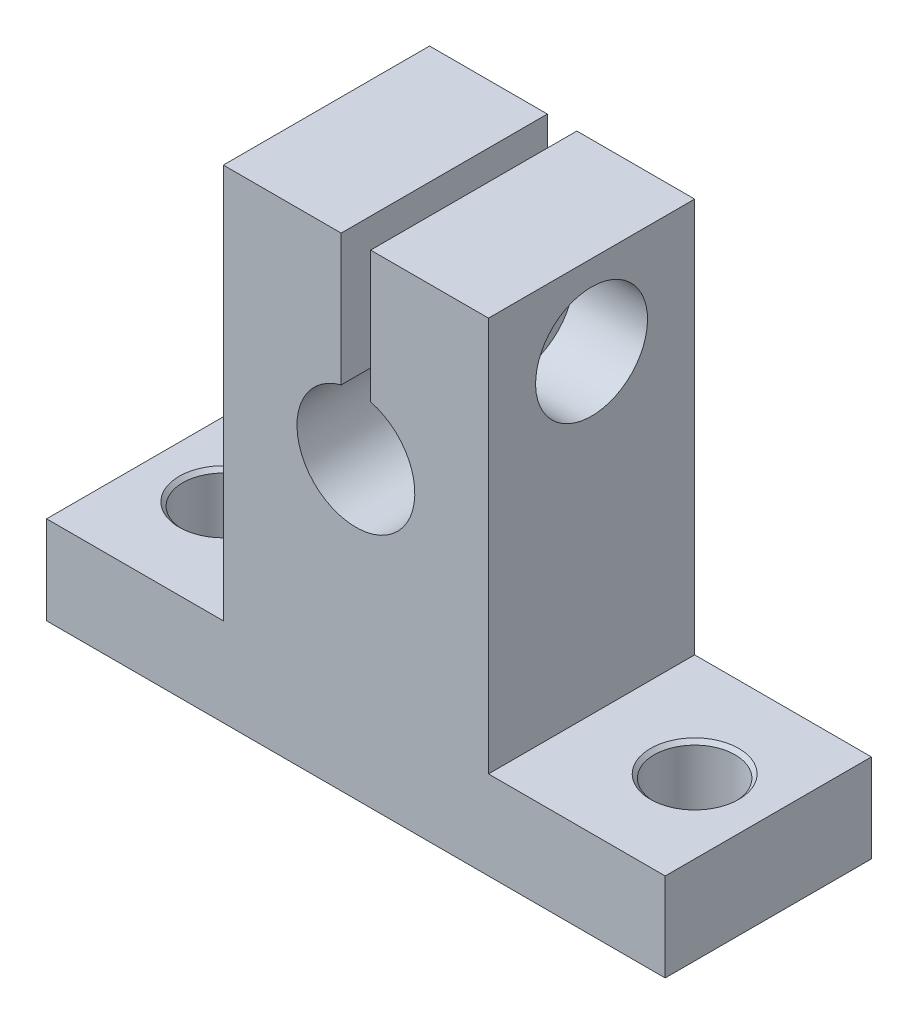
ISO-10303-21;
HEADER;
FILE_DESCRIPTION(('STEP AP214'),'2;1');
FILE_NAME('part.step','',(''),(''),'','','');
FILE_SCHEMA(('AUTOMOTIVE_DESIGN { 1 0 10303 214 1 1 1 1 }'));
ENDSEC;
DATA;
#1=APPLICATION_CONTEXT('core data for automotive mechanical design processes');
#2=APPLICATION_PROTOCOL_DEFINITION('international standard','automotive_design',2000,#1);
#3=PRODUCT_CONTEXT('',#1,'mechanical');
#4=PRODUCT('Part','Part','',(#3));
#5=PRODUCT_RELATED_PRODUCT_CATEGORY('part','',(#4));
#6=PRODUCT_DEFINITION_FORMATION('','',#4);
#7=PRODUCT_DEFINITION_CONTEXT('part definition',#1,'design');
#8=PRODUCT_DEFINITION('design','',#6,#7);
#9=PRODUCT_DEFINITION_SHAPE('','',#8);
#10=(LENGTH_UNIT() NAMED_UNIT(*) SI_UNIT(.MILLI.,.METRE.));
#11=(NAMED_UNIT(*) PLANE_ANGLE_UNIT() SI_UNIT($,.RADIAN.));
#12=(NAMED_UNIT(*) SI_UNIT($,.STERADIAN.) SOLID_ANGLE_UNIT());
#13=UNCERTAINTY_MEASURE_WITH_UNIT(LENGTH_MEASURE(1.E-05),#10,'distance_accuracy_value','');
#14=(GEOMETRIC_REPRESENTATION_CONTEXT(3) GLOBAL_UNCERTAINTY_ASSIGNED_CONTEXT((#13)) GLOBAL_UNIT_ASSIGNED_CONTEXT((#10,
#11,#12)) REPRESENTATION_CONTEXT('',''));
#15=CARTESIAN_POINT('',(0.,0.,0.));
#16=DIRECTION('',(0.,0.,1.));
#17=DIRECTION('',(1.,0.,0.));
#18=AXIS2_PLACEMENT_3D('',#15,#16,#17);
#19=CARTESIAN_POINT('',(-4.93969696196699,10.9364916731037,0.));
#20=DIRECTION('',(1.,0.,0.));
#21=DIRECTION('',(0.,1.,0.));
#22=AXIS2_PLACEMENT_3D('',#19,#20,#21);
#23=CYLINDRICAL_SURFACE('',#22,2.1);
#24=CARTESIAN_POINT('',(1.,10.9364916731037,0.));
#25=DIRECTION('',(1.,0.,0.));
#26=DIRECTION('',(0.,1.,0.));
#27=AXIS2_PLACEMENT_3D('',#24,#25,#26);
#28=CIRCLE('',#27,2.1);
#29=CARTESIAN_POINT('',(1.,13.0364916731037,0.));
#30=VERTEX_POINT('',#29);
#31=EDGE_CURVE('E214',#30,#30,#28,.F.);
#32=ORIENTED_EDGE('',*,*,#31,.T.);
#33=EDGE_LOOP('',(#32));
#34=FACE_BOUND('',#33,.T.);
#35=CARTESIAN_POINT('',(4.,10.9364916731037,0.));
#36=DIRECTION('',(1.,0.,0.));
#37=DIRECTION('',(0.,1.,0.));
#38=AXIS2_PLACEMENT_3D('',#35,#36,#37);
#39=CIRCLE('',#38,2.1);
#40=CARTESIAN_POINT('',(4.,13.0364916731037,0.));
#41=VERTEX_POINT('',#40);
#42=EDGE_CURVE('E211',#41,#41,#39,.F.);
#43=ORIENTED_EDGE('',*,*,#42,.F.);
#44=EDGE_LOOP('',(#43));
#45=FACE_BOUND('',#44,.T.);
#46=ADVANCED_FACE('F38',(#34,#45),#23,.F.);
#47=CARTESIAN_POINT('',(-9.,-10.4,7.));
#48=DIRECTION('',(1.,0.,0.));
#49=DIRECTION('',(0.,1.,0.));
#50=AXIS2_PLACEMENT_3D('',#47,#48,#49);
#51=PLANE('',#50);
#52=CARTESIAN_POINT('',(-9.,10.9364916731037,0.));
#53=DIRECTION('',(1.,0.,0.));
#54=DIRECTION('',(0.,1.,0.));
#55=AXIS2_PLACEMENT_3D('',#52,#53,#54);
#56=CIRCLE('',#55,1.9);
#57=CARTESIAN_POINT('',(-9.,12.8364916731037,0.));
#58=VERTEX_POINT('',#57);
#59=EDGE_CURVE('E11',#58,#58,#56,.T.);
#60=ORIENTED_EDGE('',*,*,#59,.T.);
#61=EDGE_LOOP('',(#60));
#62=FACE_BOUND('',#61,.T.);
#63=DIRECTION('',(0.,-1.,0.));
#64=VECTOR('',#63,1.);
#65=CARTESIAN_POINT('',(-9.,-10.4,-7.));
#66=LINE('',#65,#64);
#67=CARTESIAN_POINT('',(-9.,16.4,-7.));
#68=VERTEX_POINT('',#67);
#69=CARTESIAN_POINT('',(-9.,-10.4,-7.));
#70=VERTEX_POINT('',#69);
#71=EDGE_CURVE('E160',#68,#70,#66,.T.);
#72=ORIENTED_EDGE('',*,*,#71,.T.);
#73=DIRECTION('',(0.,0.,-1.));
#74=VECTOR('',#73,1.);
#75=CARTESIAN_POINT('',(-9.,-10.4,7.));
#76=LINE('',#75,#74);
#77=CARTESIAN_POINT('',(-9.,-10.4,7.));
#78=VERTEX_POINT('',#77);
#79=EDGE_CURVE('E208',#78,#70,#76,.T.);
#80=ORIENTED_EDGE('',*,*,#79,.F.);
#81=DIRECTION('',(0.,-1.,0.));
#82=VECTOR('',#81,1.);
#83=CARTESIAN_POINT('',(-9.,-10.4,7.));
#84=LINE('',#83,#82);
#85=CARTESIAN_POINT('',(-9.,16.4,7.));
#86=VERTEX_POINT('',#85);
#87=EDGE_CURVE('E183',#86,#78,#84,.T.);
#88=ORIENTED_EDGE('',*,*,#87,.F.);
#89=DIRECTION('',(0.,0.,-1.));
#90=VECTOR('',#89,1.);
#91=CARTESIAN_POINT('',(-9.,16.4,7.));
#92=LINE('',#91,#90);
#93=EDGE_CURVE('E156',#86,#68,#92,.T.);
#94=ORIENTED_EDGE('',*,*,#93,.T.);
#95=EDGE_LOOP('',(#72,#80,#88,#94));
#96=FACE_BOUND('',#95,.T.);
#97=ADVANCED_FACE('F242',(#62,#96),#51,.F.);
#98=CARTESIAN_POINT('',(-21.,-10.4,7.));
#99=DIRECTION('',(0.,-1.,0.));
#100=DIRECTION('',(0.,0.,-1.));
#101=AXIS2_PLACEMENT_3D('',#98,#99,#100);
#102=PLANE('',#101);
#103=CARTESIAN_POINT('',(-16.,-10.4,0.));
#104=DIRECTION('',(0.,-1.,0.));
#105=DIRECTION('',(0.,0.,-1.));
#106=AXIS2_PLACEMENT_3D('',#103,#104,#105);
#107=CIRCLE('',#106,3.00000000000003);
#108=CARTESIAN_POINT('',(-16.,-10.4,-3.00000000000003));
#109=VERTEX_POINT('',#108);
#110=EDGE_CURVE('E224',#109,#109,#107,.T.);
#111=ORIENTED_EDGE('',*,*,#110,.T.);
#112=EDGE_LOOP('',(#111));
#113=FACE_BOUND('',#112,.T.);
#114=DIRECTION('',(-1.,0.,0.));
#115=VECTOR('',#114,1.);
#116=CARTESIAN_POINT('',(-21.,-10.4,-7.));
#117=LINE('',#116,#115);
#118=CARTESIAN_POINT('',(-21.,-10.4,-7.));
#119=VERTEX_POINT('',#118);
#120=EDGE_CURVE('E163',#70,#119,#117,.T.);
#121=ORIENTED_EDGE('',*,*,#120,.T.);
#122=DIRECTION('',(0.,0.,-1.));
#123=VECTOR('',#122,1.);
#124=CARTESIAN_POINT('',(-21.,-10.4,7.));
#125=LINE('',#124,#123);
#126=CARTESIAN_POINT('',(-21.,-10.4,7.));
#127=VERTEX_POINT('',#126);
#128=EDGE_CURVE('E205',#127,#119,#125,.T.);
#129=ORIENTED_EDGE('',*,*,#128,.F.);
#130=DIRECTION('',(-1.,0.,0.));
#131=VECTOR('',#130,1.);
#132=CARTESIAN_POINT('',(-21.,-10.4,7.));
#133=LINE('',#132,#131);
#134=EDGE_CURVE('E111',#78,#127,#133,.T.);
#135=ORIENTED_EDGE('',*,*,#134,.F.);
#136=ORIENTED_EDGE('',*,*,#79,.T.);
#137=EDGE_LOOP('',(#121,#129,#135,#136));
#138=FACE_BOUND('',#137,.T.);
#139=ADVANCED_FACE('F248',(#113,#138),#102,.F.);
#140=CARTESIAN_POINT('',(-21.,-16.4,7.));
#141=DIRECTION('',(1.,0.,0.));
#142=DIRECTION('',(0.,0.,-1.));
#143=AXIS2_PLACEMENT_3D('',#140,#141,#142);
#144=PLANE('',#143);
#145=DIRECTION('',(0.,-1.,0.));
#146=VECTOR('',#145,1.);
#147=CARTESIAN_POINT('',(-21.,-16.4,-7.));
#148=LINE('',#147,#146);
#149=CARTESIAN_POINT('',(-21.,-16.4,-7.));
#150=VERTEX_POINT('',#149);
#151=EDGE_CURVE('E166',#119,#150,#148,.T.);
#152=ORIENTED_EDGE('',*,*,#151,.T.);
#153=DIRECTION('',(0.,0.,-1.));
#154=VECTOR('',#153,1.);
#155=CARTESIAN_POINT('',(-21.,-16.4,7.));
#156=LINE('',#155,#154);
#157=CARTESIAN_POINT('',(-21.,-16.4,7.));
#158=VERTEX_POINT('',#157);
#159=EDGE_CURVE('E202',#158,#150,#156,.T.);
#160=ORIENTED_EDGE('',*,*,#159,.F.);
#161=DIRECTION('',(0.,-1.,0.));
#162=VECTOR('',#161,1.);
#163=CARTESIAN_POINT('',(-21.,-16.4,7.));
#164=LINE('',#163,#162);
#165=EDGE_CURVE('E336',#127,#158,#164,.T.);
#166=ORIENTED_EDGE('',*,*,#165,.F.);
#167=ORIENTED_EDGE('',*,*,#128,.T.);
#168=EDGE_LOOP('',(#152,#160,#166,#167));
#169=FACE_BOUND('',#168,.T.);
#170=ADVANCED_FACE('F305',(#169),#144,.F.);
#171=CARTESIAN_POINT('',(21.,-16.4,7.));
#172=DIRECTION('',(0.,1.,0.));
#173=DIRECTION('',(-1.,0.,0.));
#174=AXIS2_PLACEMENT_3D('',#171,#172,#173);
#175=PLANE('',#174);
#176=CARTESIAN_POINT('',(16.,-16.4,0.));
#177=DIRECTION('',(0.,1.,0.));
#178=DIRECTION('',(-1.,0.,0.));
#179=AXIS2_PLACEMENT_3D('',#176,#177,#178);
#180=CIRCLE('',#179,2.75);
#181=CARTESIAN_POINT('',(13.25,-16.4,0.));
#182=VERTEX_POINT('',#181);
#183=EDGE_CURVE('E325',#182,#182,#180,.F.);
#184=ORIENTED_EDGE('',*,*,#183,.F.);
#185=EDGE_LOOP('',(#184));
#186=FACE_BOUND('',#185,.T.);
#187=CARTESIAN_POINT('',(-16.,-16.4,0.));
#188=DIRECTION('',(0.,1.,0.));
#189=DIRECTION('',(-1.,0.,0.));
#190=AXIS2_PLACEMENT_3D('',#187,#188,#189);
#191=CIRCLE('',#190,2.75);
#192=CARTESIAN_POINT('',(-18.75,-16.4,0.));
#193=VERTEX_POINT('',#192);
#194=EDGE_CURVE('E164',#193,#193,#191,.F.);
#195=ORIENTED_EDGE('',*,*,#194,.F.);
#196=EDGE_LOOP('',(#195));
#197=FACE_BOUND('',#196,.T.);
#198=DIRECTION('',(1.,0.,0.));
#199=VECTOR('',#198,1.);
#200=CARTESIAN_POINT('',(21.,-16.4,-7.));
#201=LINE('',#200,#199);
#202=CARTESIAN_POINT('',(21.,-16.4,-7.));
#203=VERTEX_POINT('',#202);
#204=EDGE_CURVE('E168',#150,#203,#201,.T.);
#205=ORIENTED_EDGE('',*,*,#204,.T.);
#206=DIRECTION('',(0.,0.,-1.));
#207=VECTOR('',#206,1.);
#208=CARTESIAN_POINT('',(21.,-16.4,7.));
#209=LINE('',#208,#207);
#210=CARTESIAN_POINT('',(21.,-16.4,7.));
#211=VERTEX_POINT('',#210);
#212=EDGE_CURVE('E199',#211,#203,#209,.T.);
#213=ORIENTED_EDGE('',*,*,#212,.F.);
#214=DIRECTION('',(1.,0.,0.));
#215=VECTOR('',#214,1.);
#216=CARTESIAN_POINT('',(21.,-16.4,7.));
#217=LINE('',#216,#215);
#218=EDGE_CURVE('E338',#158,#211,#217,.T.);
#219=ORIENTED_EDGE('',*,*,#218,.F.);
#220=ORIENTED_EDGE('',*,*,#159,.T.);
#221=EDGE_LOOP('',(#205,#213,#219,#220));
#222=FACE_BOUND('',#221,.T.);
#223=ADVANCED_FACE('F301',(#186,#197,#222),#175,.F.);
#224=CARTESIAN_POINT('',(21.,-10.4,7.));
#225=DIRECTION('',(-1.,0.,0.));
#226=DIRECTION('',(0.,0.,1.));
#227=AXIS2_PLACEMENT_3D('',#224,#225,#226);
#228=PLANE('',#227);
#229=DIRECTION('',(0.,1.,0.));
#230=VECTOR('',#229,1.);
#231=CARTESIAN_POINT('',(21.,-10.4,-7.));
#232=LINE('',#231,#230);
#233=CARTESIAN_POINT('',(21.,-10.4,-7.));
#234=VERTEX_POINT('',#233);
#235=EDGE_CURVE('E170',#203,#234,#232,.T.);
#236=ORIENTED_EDGE('',*,*,#235,.T.);
#237=DIRECTION('',(0.,0.,-1.));
#238=VECTOR('',#237,1.);
#239=CARTESIAN_POINT('',(21.,-10.4,7.));
#240=LINE('',#239,#238);
#241=CARTESIAN_POINT('',(21.,-10.4,7.));
#242=VERTEX_POINT('',#241);
#243=EDGE_CURVE('E196',#242,#234,#240,.T.);
#244=ORIENTED_EDGE('',*,*,#243,.F.);
#245=DIRECTION('',(0.,1.,0.));
#246=VECTOR('',#245,1.);
#247=CARTESIAN_POINT('',(21.,-10.4,7.));
#248=LINE('',#247,#246);
#249=EDGE_CURVE('E340',#211,#242,#248,.T.);
#250=ORIENTED_EDGE('',*,*,#249,.F.);
#251=ORIENTED_EDGE('',*,*,#212,.T.);
#252=EDGE_LOOP('',(#236,#244,#250,#251));
#253=FACE_BOUND('',#252,.T.);
#254=ADVANCED_FACE('F297',(#253),#228,.F.);
#255=CARTESIAN_POINT('',(9.,-10.4,7.));
#256=DIRECTION('',(0.,-1.,0.));
#257=DIRECTION('',(1.,0.,0.));
#258=AXIS2_PLACEMENT_3D('',#255,#256,#257);
#259=PLANE('',#258);
#260=CARTESIAN_POINT('',(16.,-10.4,0.));
#261=DIRECTION('',(0.,-1.,0.));
#262=DIRECTION('',(1.,0.,0.));
#263=AXIS2_PLACEMENT_3D('',#260,#261,#262);
#264=CIRCLE('',#263,3.00000000000004);
#265=CARTESIAN_POINT('',(19.,-10.4,0.));
#266=VERTEX_POINT('',#265);
#267=EDGE_CURVE('E218',#266,#266,#264,.T.);
#268=ORIENTED_EDGE('',*,*,#267,.T.);
#269=EDGE_LOOP('',(#268));
#270=FACE_BOUND('',#269,.T.);
#271=DIRECTION('',(-1.,0.,0.));
#272=VECTOR('',#271,1.);
#273=CARTESIAN_POINT('',(9.,-10.4,-7.));
#274=LINE('',#273,#272);
#275=CARTESIAN_POINT('',(9.,-10.4,-7.));
#276=VERTEX_POINT('',#275);
#277=EDGE_CURVE('E172',#234,#276,#274,.T.);
#278=ORIENTED_EDGE('',*,*,#277,.T.);
#279=DIRECTION('',(0.,0.,-1.));
#280=VECTOR('',#279,1.);
#281=CARTESIAN_POINT('',(9.,-10.4,7.));
#282=LINE('',#281,#280);
#283=CARTESIAN_POINT('',(9.,-10.4,7.));
#284=VERTEX_POINT('',#283);
#285=EDGE_CURVE('E193',#284,#276,#282,.T.);
#286=ORIENTED_EDGE('',*,*,#285,.F.);
#287=DIRECTION('',(-1.,0.,0.));
#288=VECTOR('',#287,1.);
#289=CARTESIAN_POINT('',(9.,-10.4,7.));
#290=LINE('',#289,#288);
#291=EDGE_CURVE('E342',#242,#284,#290,.T.);
#292=ORIENTED_EDGE('',*,*,#291,.F.);
#293=ORIENTED_EDGE('',*,*,#243,.T.);
#294=EDGE_LOOP('',(#278,#286,#292,#293));
#295=FACE_BOUND('',#294,.T.);
#296=ADVANCED_FACE('F293',(#270,#295),#259,.F.);
#297=CARTESIAN_POINT('',(9.,16.4,7.));
#298=DIRECTION('',(-1.,0.,0.));
#299=DIRECTION('',(0.,-1.,0.));
#300=AXIS2_PLACEMENT_3D('',#297,#298,#299);
#301=PLANE('',#300);
#302=CARTESIAN_POINT('',(9.,10.9364916731037,0.));
#303=DIRECTION('',(1.,0.,0.));
#304=DIRECTION('',(0.,1.,0.));
#305=AXIS2_PLACEMENT_3D('',#302,#303,#304);
#306=CIRCLE('',#305,3.8);
#307=CARTESIAN_POINT('',(9.,14.7364916731037,0.));
#308=VERTEX_POINT('',#307);
#309=EDGE_CURVE('E375',#308,#308,#306,.T.);
#310=ORIENTED_EDGE('',*,*,#309,.F.);
#311=EDGE_LOOP('',(#310));
#312=FACE_BOUND('',#311,.T.);
#313=DIRECTION('',(0.,1.,0.));
#314=VECTOR('',#313,1.);
#315=CARTESIAN_POINT('',(9.,16.4,-7.));
#316=LINE('',#315,#314);
#317=CARTESIAN_POINT('',(9.,16.4,-7.));
#318=VERTEX_POINT('',#317);
#319=EDGE_CURVE('E174',#276,#318,#316,.T.);
#320=ORIENTED_EDGE('',*,*,#319,.T.);
#321=DIRECTION('',(0.,0.,-1.));
#322=VECTOR('',#321,1.);
#323=CARTESIAN_POINT('',(9.,16.4,7.));
#324=LINE('',#323,#322);
#325=CARTESIAN_POINT('',(9.,16.4,7.));
#326=VERTEX_POINT('',#325);
#327=EDGE_CURVE('E190',#326,#318,#324,.T.);
#328=ORIENTED_EDGE('',*,*,#327,.F.);
#329=DIRECTION('',(0.,1.,0.));
#330=VECTOR('',#329,1.);
#331=CARTESIAN_POINT('',(9.,16.4,7.));
#332=LINE('',#331,#330);
#333=EDGE_CURVE('E344',#284,#326,#332,.T.);
#334=ORIENTED_EDGE('',*,*,#333,.F.);
#335=ORIENTED_EDGE('',*,*,#285,.T.);
#336=EDGE_LOOP('',(#320,#328,#334,#335));
#337=FACE_BOUND('',#336,.T.);
#338=ADVANCED_FACE('F289',(#312,#337),#301,.F.);
#339=CARTESIAN_POINT('',(0.999999999999999,16.4,7.));
#340=DIRECTION('',(0.,-1.,0.));
#341=DIRECTION('',(1.,0.,0.));
#342=AXIS2_PLACEMENT_3D('',#339,#340,#341);
#343=PLANE('',#342);
#344=DIRECTION('',(-1.,0.,0.));
#345=VECTOR('',#344,1.);
#346=CARTESIAN_POINT('',(0.999999999999999,16.4,-7.));
#347=LINE('',#346,#345);
#348=CARTESIAN_POINT('',(0.999999999999999,16.4,-7.));
#349=VERTEX_POINT('',#348);
#350=EDGE_CURVE('E176',#318,#349,#347,.T.);
#351=ORIENTED_EDGE('',*,*,#350,.T.);
#352=DIRECTION('',(0.,0.,-1.));
#353=VECTOR('',#352,1.);
#354=CARTESIAN_POINT('',(0.999999999999999,16.4,7.));
#355=LINE('',#354,#353);
#356=CARTESIAN_POINT('',(0.999999999999999,16.4,7.));
#357=VERTEX_POINT('',#356);
#358=EDGE_CURVE('E187',#357,#349,#355,.T.);
#359=ORIENTED_EDGE('',*,*,#358,.F.);
#360=DIRECTION('',(-1.,0.,0.));
#361=VECTOR('',#360,1.);
#362=CARTESIAN_POINT('',(0.999999999999999,16.4,7.));
#363=LINE('',#362,#361);
#364=EDGE_CURVE('E346',#326,#357,#363,.T.);
#365=ORIENTED_EDGE('',*,*,#364,.F.);
#366=ORIENTED_EDGE('',*,*,#327,.T.);
#367=EDGE_LOOP('',(#351,#359,#365,#366));
#368=FACE_BOUND('',#367,.T.);
#369=ADVANCED_FACE('F285',(#368),#343,.F.);
#370=CARTESIAN_POINT('',(1.,7.47298334620742,7.));
#371=DIRECTION('',(1.,0.,0.));
#372=DIRECTION('',(0.,1.,0.));
#373=AXIS2_PLACEMENT_3D('',#370,#371,#372);
#374=PLANE('',#373);
#375=ORIENTED_EDGE('',*,*,#31,.F.);
#376=EDGE_LOOP('',(#375));
#377=FACE_BOUND('',#376,.T.);
#378=DIRECTION('',(0.,-1.,0.));
#379=VECTOR('',#378,1.);
#380=CARTESIAN_POINT('',(1.,7.47298334620742,-7.));
#381=LINE('',#380,#379);
#382=CARTESIAN_POINT('',(1.,7.47298334620742,-7.));
#383=VERTEX_POINT('',#382);
#384=EDGE_CURVE('E178',#349,#383,#381,.T.);
#385=ORIENTED_EDGE('',*,*,#384,.T.);
#386=DIRECTION('',(0.,0.,-1.));
#387=VECTOR('',#386,1.);
#388=CARTESIAN_POINT('',(1.,7.47298334620742,7.));
#389=LINE('',#388,#387);
#390=CARTESIAN_POINT('',(1.,7.47298334620742,7.));
#391=VERTEX_POINT('',#390);
#392=EDGE_CURVE('E151',#391,#383,#389,.T.);
#393=ORIENTED_EDGE('',*,*,#392,.F.);
#394=DIRECTION('',(0.,-1.,0.));
#395=VECTOR('',#394,1.);
#396=CARTESIAN_POINT('',(1.,7.47298334620742,7.));
#397=LINE('',#396,#395);
#398=EDGE_CURVE('E142',#357,#391,#397,.T.);
#399=ORIENTED_EDGE('',*,*,#398,.F.);
#400=ORIENTED_EDGE('',*,*,#358,.T.);
#401=EDGE_LOOP('',(#385,#393,#399,#400));
#402=FACE_BOUND('',#401,.T.);
#403=ADVANCED_FACE('F282',(#377,#402),#374,.F.);
#404=CARTESIAN_POINT('',(0.,3.6,7.));
#405=DIRECTION('',(0.,0.,-1.));
#406=DIRECTION('',(-1.,0.,0.));
#407=AXIS2_PLACEMENT_3D('',#404,#405,#406);
#408=CYLINDRICAL_SURFACE('',#407,4.);
#409=CARTESIAN_POINT('',(0.,3.6,-7.));
#410=DIRECTION('',(0.,0.,-1.));
#411=DIRECTION('',(1.,0.,0.));
#412=AXIS2_PLACEMENT_3D('',#409,#410,#411);
#413=CIRCLE('',#412,4.);
#414=CARTESIAN_POINT('',(-0.999999999999999,7.47298334620742,-7.));
#415=VERTEX_POINT('',#414);
#416=EDGE_CURVE('E150',#383,#415,#413,.T.);
#417=ORIENTED_EDGE('',*,*,#416,.T.);
#418=DIRECTION('',(0.,0.,-1.));
#419=VECTOR('',#418,1.);
#420=CARTESIAN_POINT('',(-0.999999999999999,7.47298334620742,7.));
#421=LINE('',#420,#419);
#422=CARTESIAN_POINT('',(-0.999999999999999,7.47298334620742,7.));
#423=VERTEX_POINT('',#422);
#424=EDGE_CURVE('E147',#423,#415,#421,.T.);
#425=ORIENTED_EDGE('',*,*,#424,.F.);
#426=CARTESIAN_POINT('',(0.,3.6,7.));
#427=DIRECTION('',(0.,0.,-1.));
#428=DIRECTION('',(1.,0.,0.));
#429=AXIS2_PLACEMENT_3D('',#426,#427,#428);
#430=CIRCLE('',#429,4.);
#431=EDGE_CURVE('E136',#391,#423,#430,.T.);
#432=ORIENTED_EDGE('',*,*,#431,.F.);
#433=ORIENTED_EDGE('',*,*,#392,.T.);
#434=EDGE_LOOP('',(#417,#425,#432,#433));
#435=FACE_BOUND('',#434,.T.);
#436=ADVANCED_FACE('F148',(#435),#408,.F.);
#437=CARTESIAN_POINT('',(-1.,16.4,7.));
#438=DIRECTION('',(-1.,0.,0.));
#439=DIRECTION('',(0.,-1.,0.));
#440=AXIS2_PLACEMENT_3D('',#437,#438,#439);
#441=PLANE('',#440);
#442=CARTESIAN_POINT('',(-0.999999999999998,10.9364916731037,0.));
#443=DIRECTION('',(1.,0.,0.));
#444=DIRECTION('',(0.,0.,-1.));
#445=AXIS2_PLACEMENT_3D('',#442,#443,#444);
#446=CIRCLE('',#445,1.65);
#447=CARTESIAN_POINT('',(-0.999999999999998,10.9364916731037,-1.65));
#448=VERTEX_POINT('',#447);
#449=EDGE_CURVE('E326',#448,#448,#446,.T.);
#450=ORIENTED_EDGE('',*,*,#449,.F.);
#451=EDGE_LOOP('',(#450));
#452=FACE_BOUND('',#451,.T.);
#453=DIRECTION('',(0.,1.,0.));
#454=VECTOR('',#453,1.);
#455=CARTESIAN_POINT('',(-1.,16.4,-7.));
#456=LINE('',#455,#454);
#457=CARTESIAN_POINT('',(-1.,16.4,-7.));
#458=VERTEX_POINT('',#457);
#459=EDGE_CURVE('E96',#415,#458,#456,.T.);
#460=ORIENTED_EDGE('',*,*,#459,.T.);
#461=DIRECTION('',(0.,0.,-1.));
#462=VECTOR('',#461,1.);
#463=CARTESIAN_POINT('',(-1.,16.4,7.));
#464=LINE('',#463,#462);
#465=CARTESIAN_POINT('',(-1.,16.4,7.));
#466=VERTEX_POINT('',#465);
#467=EDGE_CURVE('E152',#466,#458,#464,.T.);
#468=ORIENTED_EDGE('',*,*,#467,.F.);
#469=DIRECTION('',(0.,1.,0.));
#470=VECTOR('',#469,1.);
#471=CARTESIAN_POINT('',(-1.,16.4,7.));
#472=LINE('',#471,#470);
#473=EDGE_CURVE('E140',#423,#466,#472,.T.);
#474=ORIENTED_EDGE('',*,*,#473,.F.);
#475=ORIENTED_EDGE('',*,*,#424,.T.);
#476=EDGE_LOOP('',(#460,#468,#474,#475));
#477=FACE_BOUND('',#476,.T.);
#478=ADVANCED_FACE('F154',(#452,#477),#441,.F.);
#479=CARTESIAN_POINT('',(-9.,16.4,7.));
#480=DIRECTION('',(0.,-1.,0.));
#481=DIRECTION('',(0.,0.,-1.));
#482=AXIS2_PLACEMENT_3D('',#479,#480,#481);
#483=PLANE('',#482);
#484=DIRECTION('',(-1.,0.,0.));
#485=VECTOR('',#484,1.);
#486=CARTESIAN_POINT('',(-9.,16.4,-7.));
#487=LINE('',#486,#485);
#488=EDGE_CURVE('E102',#458,#68,#487,.T.);
#489=ORIENTED_EDGE('',*,*,#488,.T.);
#490=ORIENTED_EDGE('',*,*,#93,.F.);
#491=DIRECTION('',(-1.,0.,0.));
#492=VECTOR('',#491,1.);
#493=CARTESIAN_POINT('',(-9.,16.4,7.));
#494=LINE('',#493,#492);
#495=EDGE_CURVE('E55',#466,#86,#494,.T.);
#496=ORIENTED_EDGE('',*,*,#495,.F.);
#497=ORIENTED_EDGE('',*,*,#467,.T.);
#498=EDGE_LOOP('',(#489,#490,#496,#497));
#499=FACE_BOUND('',#498,.T.);
#500=ADVANCED_FACE('F271',(#499),#483,.F.);
#501=CARTESIAN_POINT('',(0.,3.6,7.));
#502=DIRECTION('',(0.,0.,1.));
#503=DIRECTION('',(1.,0.,0.));
#504=AXIS2_PLACEMENT_3D('',#501,#502,#503);
#505=PLANE('',#504);
#506=ORIENTED_EDGE('',*,*,#87,.T.);
#507=ORIENTED_EDGE('',*,*,#134,.T.);
#508=ORIENTED_EDGE('',*,*,#165,.T.);
#509=ORIENTED_EDGE('',*,*,#218,.T.);
#510=ORIENTED_EDGE('',*,*,#249,.T.);
#511=ORIENTED_EDGE('',*,*,#291,.T.);
#512=ORIENTED_EDGE('',*,*,#333,.T.);
#513=ORIENTED_EDGE('',*,*,#364,.T.);
#514=ORIENTED_EDGE('',*,*,#398,.T.);
#515=ORIENTED_EDGE('',*,*,#431,.T.);
#516=ORIENTED_EDGE('',*,*,#473,.T.);
#517=ORIENTED_EDGE('',*,*,#495,.T.);
#518=EDGE_LOOP('',(#506,#507,#508,#509,#510,#511,#512,#513,#514,#515,#516,#517));
#519=FACE_BOUND('',#518,.T.);
#520=ADVANCED_FACE('F138',(#519),#505,.T.);
#521=CARTESIAN_POINT('',(0.,3.6,-7.));
#522=DIRECTION('',(0.,0.,1.));
#523=DIRECTION('',(1.,0.,0.));
#524=AXIS2_PLACEMENT_3D('',#521,#522,#523);
#525=PLANE('',#524);
#526=ORIENTED_EDGE('',*,*,#71,.F.);
#527=ORIENTED_EDGE('',*,*,#488,.F.);
#528=ORIENTED_EDGE('',*,*,#459,.F.);
#529=ORIENTED_EDGE('',*,*,#416,.F.);
#530=ORIENTED_EDGE('',*,*,#384,.F.);
#531=ORIENTED_EDGE('',*,*,#350,.F.);
#532=ORIENTED_EDGE('',*,*,#319,.F.);
#533=ORIENTED_EDGE('',*,*,#277,.F.);
#534=ORIENTED_EDGE('',*,*,#235,.F.);
#535=ORIENTED_EDGE('',*,*,#204,.F.);
#536=ORIENTED_EDGE('',*,*,#151,.F.);
#537=ORIENTED_EDGE('',*,*,#120,.F.);
#538=EDGE_LOOP('',(#526,#527,#528,#529,#530,#531,#532,#533,#534,#535,#536,#537));
#539=FACE_BOUND('',#538,.T.);
#540=ADVANCED_FACE('F267',(#539),#525,.F.);
#541=CARTESIAN_POINT('',(-16.,-24.178174593052,0.));
#542=DIRECTION('',(0.,1.,0.));
#543=DIRECTION('',(-1.,0.,0.));
#544=AXIS2_PLACEMENT_3D('',#541,#542,#543);
#545=CYLINDRICAL_SURFACE('',#544,2.75);
#546=CARTESIAN_POINT('',(-16.,-10.65,0.));
#547=DIRECTION('',(0.,-1.,0.));
#548=DIRECTION('',(0.,0.,-1.));
#549=AXIS2_PLACEMENT_3D('',#546,#547,#548);
#550=CIRCLE('',#549,2.75);
#551=CARTESIAN_POINT('',(-18.75,-10.65,0.));
#552=VERTEX_POINT('',#551);
#553=EDGE_CURVE('E221',#552,#552,#550,.F.);
#554=CARTESIAN_POINT('',(-18.75,-10.65,0.));
#555=CARTESIAN_POINT('',(-18.75,-10.7098958333334,0.));
#556=CARTESIAN_POINT('',(-18.75,-10.7697916666667,0.));
#557=CARTESIAN_POINT('',(-18.75,-10.8895833333334,0.));
#558=CARTESIAN_POINT('',(-18.75,-10.9494791666667,0.));
#559=CARTESIAN_POINT('',(-18.75,-11.0692708333334,0.));
#560=CARTESIAN_POINT('',(-18.75,-11.1291666666667,0.));
#561=CARTESIAN_POINT('',(-18.75,-11.2489583333334,0.));
#562=CARTESIAN_POINT('',(-18.75,-11.3088541666667,0.));
#563=CARTESIAN_POINT('',(-18.75,-11.4286458333334,0.));
#564=CARTESIAN_POINT('',(-18.75,-11.4885416666667,0.));
#565=CARTESIAN_POINT('',(-18.75,-11.6083333333334,0.));
#566=CARTESIAN_POINT('',(-18.75,-11.6682291666667,0.));
#567=CARTESIAN_POINT('',(-18.75,-11.7880208333334,0.));
#568=CARTESIAN_POINT('',(-18.75,-11.8479166666667,0.));
#569=CARTESIAN_POINT('',(-18.75,-11.9677083333334,0.));
#570=CARTESIAN_POINT('',(-18.75,-12.0276041666667,0.));
#571=CARTESIAN_POINT('',(-18.75,-12.1473958333334,0.));
#572=CARTESIAN_POINT('',(-18.75,-12.2072916666667,0.));
#573=CARTESIAN_POINT('',(-18.75,-12.3270833333334,0.));
#574=CARTESIAN_POINT('',(-18.75,-12.3869791666667,0.));
#575=CARTESIAN_POINT('',(-18.75,-12.5067708333334,0.));
#576=CARTESIAN_POINT('',(-18.75,-12.5666666666667,0.));
#577=CARTESIAN_POINT('',(-18.75,-12.6864583333334,0.));
#578=CARTESIAN_POINT('',(-18.75,-12.7463541666667,0.));
#579=CARTESIAN_POINT('',(-18.75,-12.8661458333334,0.));
#580=CARTESIAN_POINT('',(-18.75,-12.9260416666667,0.));
#581=CARTESIAN_POINT('',(-18.75,-13.0458333333334,0.));
#582=CARTESIAN_POINT('',(-18.75,-13.1057291666667,0.));
#583=CARTESIAN_POINT('',(-18.75,-13.2255208333334,0.));
#584=CARTESIAN_POINT('',(-18.75,-13.2854166666667,0.));
#585=CARTESIAN_POINT('',(-18.75,-13.4052083333334,0.));
#586=CARTESIAN_POINT('',(-18.75,-13.4651041666667,0.));
#587=CARTESIAN_POINT('',(-18.75,-13.5848958333334,0.));
#588=CARTESIAN_POINT('',(-18.75,-13.6447916666667,0.));
#589=CARTESIAN_POINT('',(-18.75,-13.7645833333334,0.));
#590=CARTESIAN_POINT('',(-18.75,-13.8244791666667,0.));
#591=CARTESIAN_POINT('',(-18.75,-13.9442708333334,0.));
#592=CARTESIAN_POINT('',(-18.75,-14.0041666666667,0.));
#593=CARTESIAN_POINT('',(-18.75,-14.1239583333334,0.));
#594=CARTESIAN_POINT('',(-18.75,-14.1838541666667,0.));
#595=CARTESIAN_POINT('',(-18.75,-14.3036458333334,0.));
#596=CARTESIAN_POINT('',(-18.75,-14.3635416666667,0.));
#597=CARTESIAN_POINT('',(-18.75,-14.4833333333334,0.));
#598=CARTESIAN_POINT('',(-18.75,-14.5432291666667,0.));
#599=CARTESIAN_POINT('',(-18.75,-14.6630208333334,0.));
#600=CARTESIAN_POINT('',(-18.75,-14.7229166666667,0.));
#601=CARTESIAN_POINT('',(-18.75,-14.8427083333334,0.));
#602=CARTESIAN_POINT('',(-18.75,-14.9026041666667,0.));
#603=CARTESIAN_POINT('',(-18.75,-15.0223958333333,0.));
#604=CARTESIAN_POINT('',(-18.75,-15.0822916666667,0.));
#605=CARTESIAN_POINT('',(-18.75,-15.2020833333333,0.));
#606=CARTESIAN_POINT('',(-18.75,-15.2619791666667,0.));
#607=CARTESIAN_POINT('',(-18.75,-15.3817708333333,0.));
#608=CARTESIAN_POINT('',(-18.75,-15.4416666666667,0.));
#609=CARTESIAN_POINT('',(-18.75,-15.5614583333333,0.));
#610=CARTESIAN_POINT('',(-18.75,-15.6213541666667,0.));
#611=CARTESIAN_POINT('',(-18.75,-15.7411458333333,0.));
#612=CARTESIAN_POINT('',(-18.75,-15.8010416666667,0.));
#613=CARTESIAN_POINT('',(-18.75,-15.9208333333333,0.));
#614=CARTESIAN_POINT('',(-18.75,-15.9807291666667,0.));
#615=CARTESIAN_POINT('',(-18.75,-16.1005208333333,0.));
#616=CARTESIAN_POINT('',(-18.75,-16.1604166666667,0.));
#617=CARTESIAN_POINT('',(-18.75,-16.2802083333333,0.));
#618=CARTESIAN_POINT('',(-18.75,-16.3401041666667,0.));
#619=CARTESIAN_POINT('',(-18.75,-16.4,0.));
#620=B_SPLINE_CURVE_WITH_KNOTS('',3,(#554,#555,#556,#557,#558,#559,#560,#561,#562,#563,#564,
#565,#566,#567,#568,#569,#570,#571,#572,#573,#574,#575,#576,#577,#578,#579,#580,#581,#582,#583,
#584,#585,#586,#587,#588,#589,#590,#591,#592,#593,#594,#595,#596,#597,#598,#599,#600,#601,#602,
#603,#604,#605,#606,#607,#608,#609,#610,#611,#612,#613,#614,#615,#616,#617,#618,#619),
.UNSPECIFIED.,.F.,.F.,(4,2,2,2,2,2,2,2,2,2,2,2,2,2,2,2,2,2,2,2,2,2,2,2,2,2,2,2,2,2,2,2,4),(0.,
0.179687499999999,0.359374999999999,0.539062499999998,0.718749999999997,0.898437499999995,
1.078125,1.25781249999999,1.43749999999999,1.61718749999999,1.79687499999999,1.97656249999999,
2.15624999999999,2.33593749999999,2.51562499999999,2.69531249999999,2.87499999999999,
3.05468749999999,3.23437499999998,3.41406249999998,3.59374999999998,3.77343749999998,
3.95312499999998,4.13281249999998,4.31249999999998,4.49218749999998,4.67187499999998,
4.85156249999998,5.03124999999998,5.21093749999998,5.39062499999997,5.57031249999997,
5.74999999999997),.UNSPECIFIED.);
#621=EDGE_CURVE('BSEAM263',#552,#193,#620,.T.);
#622=ORIENTED_EDGE('',*,*,#553,.T.);
#623=ORIENTED_EDGE('',*,*,#194,.T.);
#624=ORIENTED_EDGE('',*,*,#621,.T.);
#625=ORIENTED_EDGE('',*,*,#621,.F.);
#626=EDGE_LOOP('',(#622,#624,#623,#625));
#627=FACE_BOUND('',#626,.T.);
#628=ADVANCED_FACE('F263',(#627),#545,.F.);
#629=CARTESIAN_POINT('',(16.,-24.178174593052,0.));
#630=DIRECTION('',(0.,1.,0.));
#631=DIRECTION('',(-1.,0.,0.));
#632=AXIS2_PLACEMENT_3D('',#629,#630,#631);
#633=CYLINDRICAL_SURFACE('',#632,2.75);
#634=CARTESIAN_POINT('',(16.,-10.65,0.));
#635=DIRECTION('',(0.,-1.,0.));
#636=DIRECTION('',(0.,0.,-1.));
#637=AXIS2_PLACEMENT_3D('',#634,#635,#636);
#638=CIRCLE('',#637,2.75);
#639=CARTESIAN_POINT('',(13.25,-10.65,0.));
#640=VERTEX_POINT('',#639);
#641=EDGE_CURVE('E210',#640,#640,#638,.F.);
#642=CARTESIAN_POINT('',(13.25,-10.65,0.));
#643=CARTESIAN_POINT('',(13.25,-10.7098958333334,0.));
#644=CARTESIAN_POINT('',(13.25,-10.7697916666667,0.));
#645=CARTESIAN_POINT('',(13.25,-10.8895833333334,0.));
#646=CARTESIAN_POINT('',(13.25,-10.9494791666667,0.));
#647=CARTESIAN_POINT('',(13.25,-11.0692708333334,0.));
#648=CARTESIAN_POINT('',(13.25,-11.1291666666667,0.));
#649=CARTESIAN_POINT('',(13.25,-11.2489583333334,0.));
#650=CARTESIAN_POINT('',(13.25,-11.3088541666667,0.));
#651=CARTESIAN_POINT('',(13.25,-11.4286458333334,0.));
#652=CARTESIAN_POINT('',(13.25,-11.4885416666667,0.));
#653=CARTESIAN_POINT('',(13.25,-11.6083333333334,0.));
#654=CARTESIAN_POINT('',(13.25,-11.6682291666667,0.));
#655=CARTESIAN_POINT('',(13.25,-11.7880208333334,0.));
#656=CARTESIAN_POINT('',(13.25,-11.8479166666667,0.));
#657=CARTESIAN_POINT('',(13.25,-11.9677083333334,0.));
#658=CARTESIAN_POINT('',(13.25,-12.0276041666667,0.));
#659=CARTESIAN_POINT('',(13.25,-12.1473958333334,0.));
#660=CARTESIAN_POINT('',(13.25,-12.2072916666667,0.));
#661=CARTESIAN_POINT('',(13.25,-12.3270833333334,0.));
#662=CARTESIAN_POINT('',(13.25,-12.3869791666667,0.));
#663=CARTESIAN_POINT('',(13.25,-12.5067708333334,0.));
#664=CARTESIAN_POINT('',(13.25,-12.5666666666667,0.));
#665=CARTESIAN_POINT('',(13.25,-12.6864583333334,0.));
#666=CARTESIAN_POINT('',(13.25,-12.7463541666667,0.));
#667=CARTESIAN_POINT('',(13.25,-12.8661458333334,0.));
#668=CARTESIAN_POINT('',(13.25,-12.9260416666667,0.));
#669=CARTESIAN_POINT('',(13.25,-13.0458333333334,0.));
#670=CARTESIAN_POINT('',(13.25,-13.1057291666667,0.));
#671=CARTESIAN_POINT('',(13.25,-13.2255208333334,0.));
#672=CARTESIAN_POINT('',(13.25,-13.2854166666667,0.));
#673=CARTESIAN_POINT('',(13.25,-13.4052083333334,0.));
#674=CARTESIAN_POINT('',(13.25,-13.4651041666667,0.));
#675=CARTESIAN_POINT('',(13.25,-13.5848958333334,0.));
#676=CARTESIAN_POINT('',(13.25,-13.6447916666667,0.));
#677=CARTESIAN_POINT('',(13.25,-13.7645833333334,0.));
#678=CARTESIAN_POINT('',(13.25,-13.8244791666667,0.));
#679=CARTESIAN_POINT('',(13.25,-13.9442708333334,0.));
#680=CARTESIAN_POINT('',(13.25,-14.0041666666667,0.));
#681=CARTESIAN_POINT('',(13.25,-14.1239583333334,0.));
#682=CARTESIAN_POINT('',(13.25,-14.1838541666667,0.));
#683=CARTESIAN_POINT('',(13.25,-14.3036458333334,0.));
#684=CARTESIAN_POINT('',(13.25,-14.3635416666667,0.));
#685=CARTESIAN_POINT('',(13.25,-14.4833333333334,0.));
#686=CARTESIAN_POINT('',(13.25,-14.5432291666667,0.));
#687=CARTESIAN_POINT('',(13.25,-14.6630208333333,0.));
#688=CARTESIAN_POINT('',(13.25,-14.7229166666667,0.));
#689=CARTESIAN_POINT('',(13.25,-14.8427083333333,0.));
#690=CARTESIAN_POINT('',(13.25,-14.9026041666667,0.));
#691=CARTESIAN_POINT('',(13.25,-15.0223958333333,0.));
#692=CARTESIAN_POINT('',(13.25,-15.0822916666667,0.));
#693=CARTESIAN_POINT('',(13.25,-15.2020833333333,0.));
#694=CARTESIAN_POINT('',(13.25,-15.2619791666667,0.));
#695=CARTESIAN_POINT('',(13.25,-15.3817708333333,0.));
#696=CARTESIAN_POINT('',(13.25,-15.4416666666667,0.));
#697=CARTESIAN_POINT('',(13.25,-15.5614583333333,0.));
#698=CARTESIAN_POINT('',(13.25,-15.6213541666667,0.));
#699=CARTESIAN_POINT('',(13.25,-15.7411458333333,0.));
#700=CARTESIAN_POINT('',(13.25,-15.8010416666667,0.));
#701=CARTESIAN_POINT('',(13.25,-15.9208333333333,0.));
#702=CARTESIAN_POINT('',(13.25,-15.9807291666667,0.));
#703=CARTESIAN_POINT('',(13.25,-16.1005208333333,0.));
#704=CARTESIAN_POINT('',(13.25,-16.1604166666667,0.));
#705=CARTESIAN_POINT('',(13.25,-16.2802083333333,0.));
#706=CARTESIAN_POINT('',(13.25,-16.3401041666667,0.));
#707=CARTESIAN_POINT('',(13.25,-16.4,0.));
#708=B_SPLINE_CURVE_WITH_KNOTS('',3,(#642,#643,#644,#645,#646,#647,#648,#649,#650,#651,#652,
#653,#654,#655,#656,#657,#658,#659,#660,#661,#662,#663,#664,#665,#666,#667,#668,#669,#670,#671,
#672,#673,#674,#675,#676,#677,#678,#679,#680,#681,#682,#683,#684,#685,#686,#687,#688,#689,#690,
#691,#692,#693,#694,#695,#696,#697,#698,#699,#700,#701,#702,#703,#704,#705,#706,#707),
.UNSPECIFIED.,.F.,.F.,(4,2,2,2,2,2,2,2,2,2,2,2,2,2,2,2,2,2,2,2,2,2,2,2,2,2,2,2,2,2,2,2,4),(0.,
0.179687499999999,0.359374999999997,0.539062499999996,0.718749999999994,0.898437499999993,
1.07812499999999,1.25781249999999,1.43749999999999,1.61718749999999,1.79687499999999,
1.97656249999999,2.15624999999998,2.33593749999998,2.51562499999998,2.69531249999998,
2.87499999999998,3.05468749999998,3.23437499999998,3.41406249999997,3.59374999999997,
3.77343749999997,3.95312499999997,4.13281249999997,4.31249999999997,4.49218749999997,
4.67187499999996,4.85156249999996,5.03124999999996,5.21093749999996,5.39062499999996,
5.57031249999996,5.74999999999995),.UNSPECIFIED.);
#709=EDGE_CURVE('BSEAM260',#640,#182,#708,.T.);
#710=ORIENTED_EDGE('',*,*,#641,.T.);
#711=ORIENTED_EDGE('',*,*,#183,.T.);
#712=ORIENTED_EDGE('',*,*,#709,.T.);
#713=ORIENTED_EDGE('',*,*,#709,.F.);
#714=EDGE_LOOP('',(#710,#712,#711,#713));
#715=FACE_BOUND('',#714,.T.);
#716=ADVANCED_FACE('F260',(#715),#633,.F.);
#717=CARTESIAN_POINT('',(-13.6669047558312,10.9364916731037,0.));
#718=DIRECTION('',(1.,0.,0.));
#719=DIRECTION('',(0.,0.,-1.));
#720=AXIS2_PLACEMENT_3D('',#717,#718,#719);
#721=CYLINDRICAL_SURFACE('',#720,1.65);
#722=CARTESIAN_POINT('',(-8.75,10.9364916731037,0.));
#723=DIRECTION('',(1.,0.,0.));
#724=DIRECTION('',(0.,0.,-1.));
#725=AXIS2_PLACEMENT_3D('',#722,#723,#724);
#726=CIRCLE('',#725,1.65);
#727=CARTESIAN_POINT('',(-8.75,10.9364916731037,-1.65));
#728=VERTEX_POINT('',#727);
#729=EDGE_CURVE('E47',#728,#728,#726,.F.);
#730=ORIENTED_EDGE('',*,*,#729,.T.);
#731=EDGE_LOOP('',(#730));
#732=FACE_BOUND('',#731,.T.);
#733=ORIENTED_EDGE('',*,*,#449,.T.);
#734=EDGE_LOOP('',(#733));
#735=FACE_BOUND('',#734,.T.);
#736=ADVANCED_FACE('F229',(#732,#735),#721,.F.);
#737=CARTESIAN_POINT('',(4.,10.9364916731037,0.));
#738=DIRECTION('',(1.,0.,0.));
#739=DIRECTION('',(0.,1.,0.));
#740=AXIS2_PLACEMENT_3D('',#737,#738,#739);
#741=PLANE('',#740);
#742=CARTESIAN_POINT('',(4.,10.9364916731037,0.));
#743=DIRECTION('',(1.,0.,0.));
#744=DIRECTION('',(0.,1.,0.));
#745=AXIS2_PLACEMENT_3D('',#742,#743,#744);
#746=CIRCLE('',#745,3.8);
#747=CARTESIAN_POINT('',(4.,14.7364916731037,0.));
#748=VERTEX_POINT('',#747);
#749=EDGE_CURVE('E215',#748,#748,#746,.T.);
#750=ORIENTED_EDGE('',*,*,#749,.T.);
#751=EDGE_LOOP('',(#750));
#752=FACE_BOUND('',#751,.T.);
#753=ORIENTED_EDGE('',*,*,#42,.T.);
#754=EDGE_LOOP('',(#753));
#755=FACE_BOUND('',#754,.T.);
#756=ADVANCED_FACE('F259',(#752,#755),#741,.T.);
#757=CARTESIAN_POINT('',(4.,10.9364916731037,0.));
#758=DIRECTION('',(1.,0.,0.));
#759=DIRECTION('',(0.,1.,0.));
#760=AXIS2_PLACEMENT_3D('',#757,#758,#759);
#761=CYLINDRICAL_SURFACE('',#760,3.8);
#762=ORIENTED_EDGE('',*,*,#749,.F.);
#763=EDGE_LOOP('',(#762));
#764=FACE_BOUND('',#763,.T.);
#765=ORIENTED_EDGE('',*,*,#309,.T.);
#766=EDGE_LOOP('',(#765));
#767=FACE_BOUND('',#766,.T.);
#768=ADVANCED_FACE('F255',(#764,#767),#761,.F.);
#769=CARTESIAN_POINT('',(16.,-10.65,0.));
#770=DIRECTION('',(0.,1.,0.));
#771=DIRECTION('',(0.,0.,1.));
#772=AXIS2_PLACEMENT_3D('',#769,#770,#771);
#773=CONICAL_SURFACE('',#772,2.75,0.785398163397447);
#774=ORIENTED_EDGE('',*,*,#267,.F.);
#775=EDGE_LOOP('',(#774));
#776=FACE_BOUND('',#775,.T.);
#777=ORIENTED_EDGE('',*,*,#641,.F.);
#778=EDGE_LOOP('',(#777));
#779=FACE_BOUND('',#778,.T.);
#780=ADVANCED_FACE('F238',(#776,#779),#773,.F.);
#781=CARTESIAN_POINT('',(-16.,-10.65,0.));
#782=DIRECTION('',(0.,1.,0.));
#783=DIRECTION('',(0.,0.,1.));
#784=AXIS2_PLACEMENT_3D('',#781,#782,#783);
#785=CONICAL_SURFACE('',#784,2.75,0.785398163397444);
#786=ORIENTED_EDGE('',*,*,#110,.F.);
#787=EDGE_LOOP('',(#786));
#788=FACE_BOUND('',#787,.T.);
#789=ORIENTED_EDGE('',*,*,#553,.F.);
#790=EDGE_LOOP('',(#789));
#791=FACE_BOUND('',#790,.T.);
#792=ADVANCED_FACE('F233',(#788,#791),#785,.F.);
#793=CARTESIAN_POINT('',(-8.75,10.9364916731037,0.));
#794=DIRECTION('',(-1.,0.,0.));
#795=DIRECTION('',(0.,0.,1.));
#796=AXIS2_PLACEMENT_3D('',#793,#794,#795);
#797=CONICAL_SURFACE('',#796,1.65,0.785398163397442);
#798=ORIENTED_EDGE('',*,*,#59,.F.);
#799=EDGE_LOOP('',(#798));
#800=FACE_BOUND('',#799,.T.);
#801=ORIENTED_EDGE('',*,*,#729,.F.);
#802=EDGE_LOOP('',(#801));
#803=FACE_BOUND('',#802,.T.);
#804=ADVANCED_FACE('F40',(#800,#803),#797,.F.);
#805=CLOSED_SHELL('',(#46,#97,#139,#170,#223,#254,#296,#338,#369,#403,#436,#478,#500,#520,#540,
#628,#716,#736,#756,#768,#780,#792,#804));
#806=MANIFOLD_SOLID_BREP('B2',#805);
#807=ADVANCED_BREP_SHAPE_REPRESENTATION('',(#18,#806),#14);
#808=SHAPE_DEFINITION_REPRESENTATION(#9,#807);
ENDSEC;
END-ISO-10303-21;
